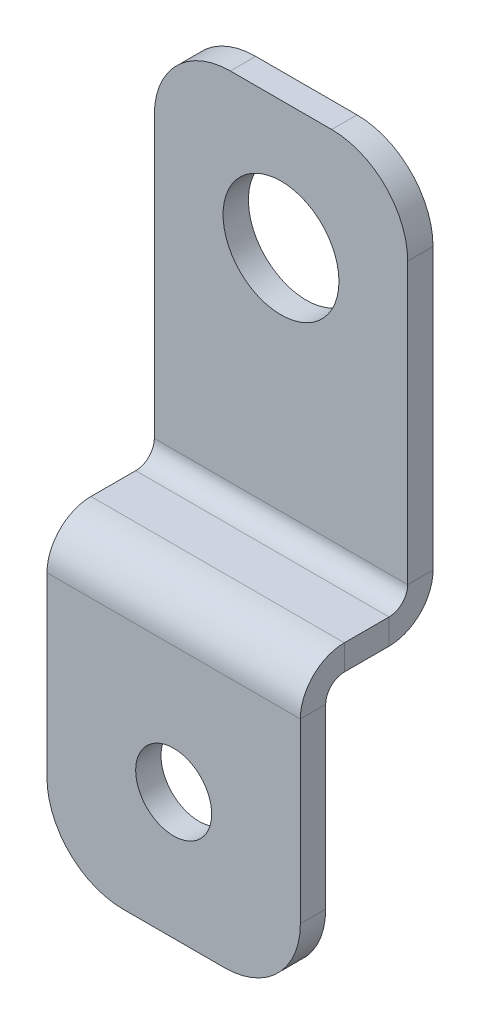
ISO-10303-21;
HEADER;
FILE_DESCRIPTION(('STEP AP214'),'2;1');
FILE_NAME('part.step','',(''),(''),'','','');
FILE_SCHEMA(('AUTOMOTIVE_DESIGN { 1 0 10303 214 1 1 1 1 }'));
ENDSEC;
DATA;
#1=APPLICATION_CONTEXT('core data for automotive mechanical design processes');
#2=APPLICATION_PROTOCOL_DEFINITION('international standard','automotive_design',2000,#1);
#3=PRODUCT_CONTEXT('',#1,'mechanical');
#4=PRODUCT('Part','Part','',(#3));
#5=PRODUCT_RELATED_PRODUCT_CATEGORY('part','',(#4));
#6=PRODUCT_DEFINITION_FORMATION('','',#4);
#7=PRODUCT_DEFINITION_CONTEXT('part definition',#1,'design');
#8=PRODUCT_DEFINITION('design','',#6,#7);
#9=PRODUCT_DEFINITION_SHAPE('','',#8);
#10=(LENGTH_UNIT() NAMED_UNIT(*) SI_UNIT(.MILLI.,.METRE.));
#11=(NAMED_UNIT(*) PLANE_ANGLE_UNIT() SI_UNIT($,.RADIAN.));
#12=(NAMED_UNIT(*) SI_UNIT($,.STERADIAN.) SOLID_ANGLE_UNIT());
#13=UNCERTAINTY_MEASURE_WITH_UNIT(LENGTH_MEASURE(1.E-05),#10,'distance_accuracy_value','');
#14=(GEOMETRIC_REPRESENTATION_CONTEXT(3) GLOBAL_UNCERTAINTY_ASSIGNED_CONTEXT((#13)) GLOBAL_UNIT_ASSIGNED_CONTEXT((#10,
#11,#12)) REPRESENTATION_CONTEXT('',''));
#15=CARTESIAN_POINT('',(0.,0.,0.));
#16=DIRECTION('',(0.,0.,1.));
#17=DIRECTION('',(1.,0.,0.));
#18=AXIS2_PLACEMENT_3D('',#15,#16,#17);
#19=CARTESIAN_POINT('',(0.,0.,1.));
#20=DIRECTION('',(0.,0.,1.));
#21=DIRECTION('',(1.,0.,0.));
#22=AXIS2_PLACEMENT_3D('',#19,#20,#21);
#23=PLANE('',#22);
#24=DIRECTION('',(-1.,0.,0.));
#25=VECTOR('',#24,1.);
#26=CARTESIAN_POINT('',(-514.974194852609,-14.350283508699,1.));
#27=LINE('',#26,#25);
#28=CARTESIAN_POINT('',(-507.974194852609,-14.350283508699,1.));
#29=VERTEX_POINT('',#28);
#30=CARTESIAN_POINT('',(-511.974194852609,-14.350283508699,1.));
#31=VERTEX_POINT('',#30);
#32=EDGE_CURVE('E307',#29,#31,#27,.T.);
#33=ORIENTED_EDGE('',*,*,#32,.T.);
#34=CARTESIAN_POINT('',(-511.974194852609,-17.350283508699,1.));
#35=DIRECTION('',(0.,0.,1.));
#36=DIRECTION('',(1.,0.,0.));
#37=AXIS2_PLACEMENT_3D('',#34,#35,#36);
#38=CIRCLE('',#37,3.);
#39=CARTESIAN_POINT('',(-514.974194852609,-17.350283508699,1.));
#40=VERTEX_POINT('',#39);
#41=EDGE_CURVE('E344',#31,#40,#38,.T.);
#42=ORIENTED_EDGE('',*,*,#41,.T.);
#43=DIRECTION('',(0.,-1.,0.));
#44=VECTOR('',#43,1.);
#45=CARTESIAN_POINT('',(-514.974194852609,-14.350283508699,1.));
#46=LINE('',#45,#44);
#47=CARTESIAN_POINT('',(-514.974194852609,-28.4078112950588,1.));
#48=VERTEX_POINT('',#47);
#49=EDGE_CURVE('E301',#40,#48,#46,.T.);
#50=ORIENTED_EDGE('',*,*,#49,.T.);
#51=DIRECTION('',(1.,0.,0.));
#52=VECTOR('',#51,1.);
#53=CARTESIAN_POINT('',(-514.974194852609,-28.4078112950588,1.));
#54=LINE('',#53,#52);
#55=CARTESIAN_POINT('',(-504.974194852609,-28.4078112950588,1.));
#56=VERTEX_POINT('',#55);
#57=EDGE_CURVE('E303',#48,#56,#54,.T.);
#58=ORIENTED_EDGE('',*,*,#57,.T.);
#59=DIRECTION('',(0.,1.,0.));
#60=VECTOR('',#59,1.);
#61=CARTESIAN_POINT('',(-504.974194852609,-14.350283508699,1.));
#62=LINE('',#61,#60);
#63=CARTESIAN_POINT('',(-504.974194852609,-17.350283508699,1.));
#64=VERTEX_POINT('',#63);
#65=EDGE_CURVE('E306',#56,#64,#62,.T.);
#66=ORIENTED_EDGE('',*,*,#65,.T.);
#67=CARTESIAN_POINT('',(-507.974194852609,-17.350283508699,1.));
#68=DIRECTION('',(0.,0.,1.));
#69=DIRECTION('',(1.,0.,0.));
#70=AXIS2_PLACEMENT_3D('',#67,#68,#69);
#71=CIRCLE('',#70,3.);
#72=EDGE_CURVE('E339',#64,#29,#71,.T.);
#73=ORIENTED_EDGE('',*,*,#72,.T.);
#74=EDGE_LOOP('',(#33,#42,#50,#58,#66,#73));
#75=FACE_BOUND('',#74,.T.);
#76=CARTESIAN_POINT('',(-509.974194852609,-19.4,1.));
#77=DIRECTION('',(0.,0.,1.));
#78=DIRECTION('',(1.,0.,0.));
#79=AXIS2_PLACEMENT_3D('',#76,#77,#78);
#80=CIRCLE('',#79,2.28730752562085);
#81=CARTESIAN_POINT('',(-507.686887326988,-19.4,1.));
#82=VERTEX_POINT('',#81);
#83=EDGE_CURVE('E294',#82,#82,#80,.T.);
#84=ORIENTED_EDGE('',*,*,#83,.F.);
#85=EDGE_LOOP('',(#84));
#86=FACE_BOUND('',#85,.T.);
#87=ADVANCED_FACE('F82',(#75,#86),#23,.T.);
#88=CARTESIAN_POINT('',(0.,0.,0.));
#89=DIRECTION('',(0.,0.,1.));
#90=DIRECTION('',(1.,0.,0.));
#91=AXIS2_PLACEMENT_3D('',#88,#89,#90);
#92=PLANE('',#91);
#93=DIRECTION('',(0.,-1.,0.));
#94=VECTOR('',#93,1.);
#95=CARTESIAN_POINT('',(-514.974194852609,-14.350283508699,0.));
#96=LINE('',#95,#94);
#97=CARTESIAN_POINT('',(-514.974194852609,-17.350283508699,0.));
#98=VERTEX_POINT('',#97);
#99=CARTESIAN_POINT('',(-514.974194852609,-28.4078112950588,0.));
#100=VERTEX_POINT('',#99);
#101=EDGE_CURVE('E296',#98,#100,#96,.T.);
#102=ORIENTED_EDGE('',*,*,#101,.F.);
#103=CARTESIAN_POINT('',(-511.974194852609,-17.350283508699,0.));
#104=DIRECTION('',(0.,0.,1.));
#105=DIRECTION('',(1.,0.,0.));
#106=AXIS2_PLACEMENT_3D('',#103,#104,#105);
#107=CIRCLE('',#106,3.);
#108=CARTESIAN_POINT('',(-511.974194852609,-14.350283508699,0.));
#109=VERTEX_POINT('',#108);
#110=EDGE_CURVE('E331',#98,#109,#107,.F.);
#111=ORIENTED_EDGE('',*,*,#110,.T.);
#112=DIRECTION('',(-1.,0.,0.));
#113=VECTOR('',#112,1.);
#114=CARTESIAN_POINT('',(-514.974194852609,-14.350283508699,0.));
#115=LINE('',#114,#113);
#116=CARTESIAN_POINT('',(-507.974194852609,-14.350283508699,0.));
#117=VERTEX_POINT('',#116);
#118=EDGE_CURVE('E302',#117,#109,#115,.T.);
#119=ORIENTED_EDGE('',*,*,#118,.F.);
#120=CARTESIAN_POINT('',(-507.974194852609,-17.350283508699,0.));
#121=DIRECTION('',(0.,0.,1.));
#122=DIRECTION('',(1.,0.,0.));
#123=AXIS2_PLACEMENT_3D('',#120,#121,#122);
#124=CIRCLE('',#123,3.);
#125=CARTESIAN_POINT('',(-504.974194852609,-17.350283508699,0.));
#126=VERTEX_POINT('',#125);
#127=EDGE_CURVE('E326',#117,#126,#124,.F.);
#128=ORIENTED_EDGE('',*,*,#127,.T.);
#129=DIRECTION('',(0.,1.,0.));
#130=VECTOR('',#129,1.);
#131=CARTESIAN_POINT('',(-504.974194852609,-14.350283508699,0.));
#132=LINE('',#131,#130);
#133=CARTESIAN_POINT('',(-504.974194852609,-28.4078112950588,0.));
#134=VERTEX_POINT('',#133);
#135=EDGE_CURVE('E320',#134,#126,#132,.T.);
#136=ORIENTED_EDGE('',*,*,#135,.F.);
#137=DIRECTION('',(1.,0.,0.));
#138=VECTOR('',#137,1.);
#139=CARTESIAN_POINT('',(-514.974194852609,-28.4078112950588,0.));
#140=LINE('',#139,#138);
#141=EDGE_CURVE('E313',#100,#134,#140,.T.);
#142=ORIENTED_EDGE('',*,*,#141,.F.);
#143=EDGE_LOOP('',(#102,#111,#119,#128,#136,#142));
#144=FACE_BOUND('',#143,.T.);
#145=CARTESIAN_POINT('',(-509.974194852609,-19.4,0.));
#146=DIRECTION('',(0.,0.,1.));
#147=DIRECTION('',(1.,0.,0.));
#148=AXIS2_PLACEMENT_3D('',#145,#146,#147);
#149=CIRCLE('',#148,2.28730752562085);
#150=CARTESIAN_POINT('',(-507.686887326988,-19.4,0.));
#151=VERTEX_POINT('',#150);
#152=EDGE_CURVE('E288',#151,#151,#149,.T.);
#153=ORIENTED_EDGE('',*,*,#152,.T.);
#154=EDGE_LOOP('',(#153));
#155=FACE_BOUND('',#154,.T.);
#156=ADVANCED_FACE('F431',(#144,#155),#92,.F.);
#157=CARTESIAN_POINT('',(-514.974194852609,-14.350283508699,1.));
#158=DIRECTION('',(1.,0.,0.));
#159=DIRECTION('',(0.,0.,-1.));
#160=AXIS2_PLACEMENT_3D('',#157,#158,#159);
#161=PLANE('',#160);
#162=ORIENTED_EDGE('',*,*,#49,.F.);
#163=DIRECTION('',(0.,0.,-1.));
#164=VECTOR('',#163,1.);
#165=CARTESIAN_POINT('',(-514.974194852609,-17.350283508699,1.));
#166=LINE('',#165,#164);
#167=EDGE_CURVE('E329',#40,#98,#166,.T.);
#168=ORIENTED_EDGE('',*,*,#167,.T.);
#169=ORIENTED_EDGE('',*,*,#101,.T.);
#170=DIRECTION('',(0.,0.,-1.));
#171=VECTOR('',#170,1.);
#172=CARTESIAN_POINT('',(-514.974194852609,-28.4078112950588,1.));
#173=LINE('',#172,#171);
#174=EDGE_CURVE('E323',#48,#100,#173,.T.);
#175=ORIENTED_EDGE('',*,*,#174,.F.);
#176=EDGE_LOOP('',(#162,#168,#169,#175));
#177=FACE_BOUND('',#176,.T.);
#178=ADVANCED_FACE('F401',(#177),#161,.F.);
#179=CARTESIAN_POINT('',(-504.974194852609,-14.350283508699,1.));
#180=DIRECTION('',(-1.,0.,0.));
#181=DIRECTION('',(0.,0.,1.));
#182=AXIS2_PLACEMENT_3D('',#179,#180,#181);
#183=PLANE('',#182);
#184=ORIENTED_EDGE('',*,*,#135,.T.);
#185=DIRECTION('',(0.,0.,-1.));
#186=VECTOR('',#185,1.);
#187=CARTESIAN_POINT('',(-504.974194852609,-17.350283508699,1.));
#188=LINE('',#187,#186);
#189=EDGE_CURVE('E345',#126,#64,#188,.F.);
#190=ORIENTED_EDGE('',*,*,#189,.T.);
#191=ORIENTED_EDGE('',*,*,#65,.F.);
#192=DIRECTION('',(0.,0.,-1.));
#193=VECTOR('',#192,1.);
#194=CARTESIAN_POINT('',(-504.974194852609,-28.4078112950588,1.));
#195=LINE('',#194,#193);
#196=EDGE_CURVE('E315',#56,#134,#195,.T.);
#197=ORIENTED_EDGE('',*,*,#196,.T.);
#198=EDGE_LOOP('',(#184,#190,#191,#197));
#199=FACE_BOUND('',#198,.T.);
#200=ADVANCED_FACE('F418',(#199),#183,.F.);
#201=CARTESIAN_POINT('',(-514.974194852609,-14.350283508699,1.));
#202=DIRECTION('',(0.,-1.,0.));
#203=DIRECTION('',(0.,0.,-1.));
#204=AXIS2_PLACEMENT_3D('',#201,#202,#203);
#205=PLANE('',#204);
#206=ORIENTED_EDGE('',*,*,#118,.T.);
#207=DIRECTION('',(0.,0.,-1.));
#208=VECTOR('',#207,1.);
#209=CARTESIAN_POINT('',(-511.974194852609,-14.350283508699,1.));
#210=LINE('',#209,#208);
#211=EDGE_CURVE('E340',#109,#31,#210,.F.);
#212=ORIENTED_EDGE('',*,*,#211,.T.);
#213=ORIENTED_EDGE('',*,*,#32,.F.);
#214=DIRECTION('',(0.,0.,-1.));
#215=VECTOR('',#214,1.);
#216=CARTESIAN_POINT('',(-507.974194852609,-14.350283508699,1.));
#217=LINE('',#216,#215);
#218=EDGE_CURVE('E333',#29,#117,#217,.T.);
#219=ORIENTED_EDGE('',*,*,#218,.T.);
#220=EDGE_LOOP('',(#206,#212,#213,#219));
#221=FACE_BOUND('',#220,.T.);
#222=ADVANCED_FACE('F439',(#221),#205,.F.);
#223=CARTESIAN_POINT('',(-509.974194852609,-19.4,1.));
#224=DIRECTION('',(0.,0.,-1.));
#225=DIRECTION('',(-1.,0.,0.));
#226=AXIS2_PLACEMENT_3D('',#223,#224,#225);
#227=CYLINDRICAL_SURFACE('',#226,2.28730752562085);
#228=ORIENTED_EDGE('',*,*,#83,.T.);
#229=EDGE_LOOP('',(#228));
#230=FACE_BOUND('',#229,.T.);
#231=ORIENTED_EDGE('',*,*,#152,.F.);
#232=EDGE_LOOP('',(#231));
#233=FACE_BOUND('',#232,.T.);
#234=ADVANCED_FACE('F430',(#230,#233),#227,.F.);
#235=CARTESIAN_POINT('',(-514.974194852609,-28.4078112950588,1.7366));
#236=DIRECTION('',(-1.,0.,0.));
#237=DIRECTION('',(0.,0.,1.));
#238=AXIS2_PLACEMENT_3D('',#235,#236,#237);
#239=PLANE('',#238);
#240=DIRECTION('',(0.,1.,0.));
#241=VECTOR('',#240,1.);
#242=CARTESIAN_POINT('',(-514.974194852609,-30.1444112950588,1.73659999999999));
#243=LINE('',#242,#241);
#244=CARTESIAN_POINT('',(-514.974194852609,-29.1444112950588,1.7366));
#245=VERTEX_POINT('',#244);
#246=CARTESIAN_POINT('',(-514.974194852609,-30.1444112950588,1.73659999999999));
#247=VERTEX_POINT('',#246);
#248=EDGE_CURVE('E248',#245,#247,#243,.F.);
#249=ORIENTED_EDGE('',*,*,#248,.F.);
#250=CARTESIAN_POINT('',(-514.974194852609,-28.4078112950588,1.7366));
#251=DIRECTION('',(1.,0.,0.));
#252=DIRECTION('',(0.,0.,-1.));
#253=AXIS2_PLACEMENT_3D('',#250,#251,#252);
#254=CIRCLE('',#253,0.7366);
#255=EDGE_CURVE('E287',#48,#245,#254,.F.);
#256=ORIENTED_EDGE('',*,*,#255,.F.);
#257=ORIENTED_EDGE('',*,*,#174,.T.);
#258=CARTESIAN_POINT('',(-514.974194852609,-28.4078112950588,1.7366));
#259=DIRECTION('',(1.,0.,0.));
#260=DIRECTION('',(0.,0.,-1.));
#261=AXIS2_PLACEMENT_3D('',#258,#259,#260);
#262=CIRCLE('',#261,1.7366);
#263=EDGE_CURVE('E285',#100,#247,#262,.F.);
#264=ORIENTED_EDGE('',*,*,#263,.T.);
#265=EDGE_LOOP('',(#249,#256,#257,#264));
#266=FACE_BOUND('',#265,.T.);
#267=ADVANCED_FACE('F396',(#266),#239,.T.);
#268=CARTESIAN_POINT('',(-504.974194852609,-28.4078112950588,1.7366));
#269=DIRECTION('',(-1.,0.,0.));
#270=DIRECTION('',(0.,0.,1.));
#271=AXIS2_PLACEMENT_3D('',#268,#269,#270);
#272=PLANE('',#271);
#273=CARTESIAN_POINT('',(-504.974194852609,-28.4078112950588,1.7366));
#274=DIRECTION('',(1.,0.,0.));
#275=DIRECTION('',(0.,0.,-1.));
#276=AXIS2_PLACEMENT_3D('',#273,#274,#275);
#277=CIRCLE('',#276,0.7366);
#278=CARTESIAN_POINT('',(-504.974194852609,-29.1444112950588,1.7366));
#279=VERTEX_POINT('',#278);
#280=EDGE_CURVE('E256',#279,#56,#277,.T.);
#281=ORIENTED_EDGE('',*,*,#280,.F.);
#282=DIRECTION('',(0.,1.,0.));
#283=VECTOR('',#282,1.);
#284=CARTESIAN_POINT('',(-504.974194852609,-29.1444112950588,1.7366));
#285=LINE('',#284,#283);
#286=CARTESIAN_POINT('',(-504.974194852609,-30.1444112950588,1.73659999999999));
#287=VERTEX_POINT('',#286);
#288=EDGE_CURVE('E279',#279,#287,#285,.F.);
#289=ORIENTED_EDGE('',*,*,#288,.T.);
#290=CARTESIAN_POINT('',(-504.974194852609,-28.4078112950588,1.7366));
#291=DIRECTION('',(1.,0.,0.));
#292=DIRECTION('',(0.,0.,-1.));
#293=AXIS2_PLACEMENT_3D('',#290,#291,#292);
#294=CIRCLE('',#293,1.7366);
#295=EDGE_CURVE('E290',#287,#134,#294,.T.);
#296=ORIENTED_EDGE('',*,*,#295,.T.);
#297=ORIENTED_EDGE('',*,*,#196,.F.);
#298=EDGE_LOOP('',(#281,#289,#296,#297));
#299=FACE_BOUND('',#298,.T.);
#300=ADVANCED_FACE('F419',(#299),#272,.F.);
#301=CARTESIAN_POINT('',(-504.974194852609,-28.4078112950588,1.7366));
#302=DIRECTION('',(1.,0.,0.));
#303=DIRECTION('',(0.,-1.,0.));
#304=AXIS2_PLACEMENT_3D('',#301,#302,#303);
#305=CYLINDRICAL_SURFACE('',#304,1.7366);
#306=ORIENTED_EDGE('',*,*,#141,.T.);
#307=ORIENTED_EDGE('',*,*,#295,.F.);
#308=DIRECTION('',(1.,0.,0.));
#309=VECTOR('',#308,1.);
#310=CARTESIAN_POINT('',(-514.974194852609,-30.1444112950588,1.73659999999999));
#311=LINE('',#310,#309);
#312=EDGE_CURVE('E274',#287,#247,#311,.F.);
#313=ORIENTED_EDGE('',*,*,#312,.T.);
#314=ORIENTED_EDGE('',*,*,#263,.F.);
#315=EDGE_LOOP('',(#306,#307,#313,#314));
#316=FACE_BOUND('',#315,.T.);
#317=ADVANCED_FACE('F391',(#316),#305,.T.);
#318=CARTESIAN_POINT('',(-504.974194852609,-28.4078112950588,1.7366));
#319=DIRECTION('',(1.,0.,0.));
#320=DIRECTION('',(0.,-1.,0.));
#321=AXIS2_PLACEMENT_3D('',#318,#319,#320);
#322=CYLINDRICAL_SURFACE('',#321,0.7366);
#323=ORIENTED_EDGE('',*,*,#57,.F.);
#324=ORIENTED_EDGE('',*,*,#255,.T.);
#325=DIRECTION('',(1.,0.,0.));
#326=VECTOR('',#325,1.);
#327=CARTESIAN_POINT('',(-514.974194852609,-29.1444112950588,1.7366));
#328=LINE('',#327,#326);
#329=EDGE_CURVE('E278',#245,#279,#328,.T.);
#330=ORIENTED_EDGE('',*,*,#329,.T.);
#331=ORIENTED_EDGE('',*,*,#280,.T.);
#332=EDGE_LOOP('',(#323,#324,#330,#331));
#333=FACE_BOUND('',#332,.T.);
#334=ADVANCED_FACE('F410',(#333),#322,.F.);
#335=CARTESIAN_POINT('',(-514.974194852609,-30.1444112950588,0.999999999999997));
#336=DIRECTION('',(1.,0.,0.));
#337=DIRECTION('',(0.,0.,-1.));
#338=AXIS2_PLACEMENT_3D('',#335,#336,#337);
#339=PLANE('',#338);
#340=ORIENTED_EDGE('',*,*,#248,.T.);
#341=DIRECTION('',(0.,0.,-1.));
#342=VECTOR('',#341,1.);
#343=CARTESIAN_POINT('',(-514.974194852609,-30.1444112950588,-1.21762754510021E-13));
#344=LINE('',#343,#342);
#345=CARTESIAN_POINT('',(-514.974194852609,-30.1444112950588,3.5));
#346=VERTEX_POINT('',#345);
#347=EDGE_CURVE('E261',#346,#247,#344,.T.);
#348=ORIENTED_EDGE('',*,*,#347,.F.);
#349=DIRECTION('',(0.,1.,0.));
#350=VECTOR('',#349,1.);
#351=CARTESIAN_POINT('',(-514.974194852609,-30.1444112950588,3.5));
#352=LINE('',#351,#350);
#353=CARTESIAN_POINT('',(-514.974194852609,-29.1444112950589,3.5));
#354=VERTEX_POINT('',#353);
#355=EDGE_CURVE('E260',#346,#354,#352,.T.);
#356=ORIENTED_EDGE('',*,*,#355,.T.);
#357=DIRECTION('',(0.,0.,1.));
#358=VECTOR('',#357,1.);
#359=CARTESIAN_POINT('',(-514.974194852609,-29.1444112950588,1.));
#360=LINE('',#359,#358);
#361=EDGE_CURVE('E272',#354,#245,#360,.F.);
#362=ORIENTED_EDGE('',*,*,#361,.T.);
#363=EDGE_LOOP('',(#340,#348,#356,#362));
#364=FACE_BOUND('',#363,.T.);
#365=ADVANCED_FACE('F388',(#364),#339,.F.);
#366=CARTESIAN_POINT('',(-504.974194852609,-30.1444112950588,3.5));
#367=DIRECTION('',(-1.,0.,0.));
#368=DIRECTION('',(0.,0.,1.));
#369=AXIS2_PLACEMENT_3D('',#366,#367,#368);
#370=PLANE('',#369);
#371=ORIENTED_EDGE('',*,*,#288,.F.);
#372=DIRECTION('',(0.,0.,-1.));
#373=VECTOR('',#372,1.);
#374=CARTESIAN_POINT('',(-504.974194852609,-29.1444112950588,3.5));
#375=LINE('',#374,#373);
#376=CARTESIAN_POINT('',(-504.974194852609,-29.1444112950588,3.5));
#377=VERTEX_POINT('',#376);
#378=EDGE_CURVE('E268',#279,#377,#375,.F.);
#379=ORIENTED_EDGE('',*,*,#378,.T.);
#380=DIRECTION('',(0.,1.,0.));
#381=VECTOR('',#380,1.);
#382=CARTESIAN_POINT('',(-504.974194852609,-30.1444112950588,3.5));
#383=LINE('',#382,#381);
#384=CARTESIAN_POINT('',(-504.974194852609,-30.1444112950588,3.5));
#385=VERTEX_POINT('',#384);
#386=EDGE_CURVE('E251',#385,#377,#383,.T.);
#387=ORIENTED_EDGE('',*,*,#386,.F.);
#388=DIRECTION('',(0.,0.,1.));
#389=VECTOR('',#388,1.);
#390=CARTESIAN_POINT('',(-504.974194852609,-30.1444112950588,-1.21762754510021E-13));
#391=LINE('',#390,#389);
#392=EDGE_CURVE('E262',#287,#385,#391,.T.);
#393=ORIENTED_EDGE('',*,*,#392,.F.);
#394=EDGE_LOOP('',(#371,#379,#387,#393));
#395=FACE_BOUND('',#394,.T.);
#396=ADVANCED_FACE('F385',(#395),#370,.F.);
#397=CARTESIAN_POINT('',(0.,-30.1444112950588,-1.21762754510021E-13));
#398=DIRECTION('',(0.,1.,0.));
#399=DIRECTION('',(0.,0.,1.));
#400=AXIS2_PLACEMENT_3D('',#397,#398,#399);
#401=PLANE('',#400);
#402=ORIENTED_EDGE('',*,*,#312,.F.);
#403=ORIENTED_EDGE('',*,*,#392,.T.);
#404=DIRECTION('',(-1.,0.,0.));
#405=VECTOR('',#404,1.);
#406=CARTESIAN_POINT('',(0.,-30.1444112950588,3.5));
#407=LINE('',#406,#405);
#408=EDGE_CURVE('E263',#385,#346,#407,.T.);
#409=ORIENTED_EDGE('',*,*,#408,.T.);
#410=ORIENTED_EDGE('',*,*,#347,.T.);
#411=EDGE_LOOP('',(#402,#403,#409,#410));
#412=FACE_BOUND('',#411,.T.);
#413=ADVANCED_FACE('F394',(#412),#401,.F.);
#414=CARTESIAN_POINT('',(0.,-29.1444112950588,-1.18271273171178E-13));
#415=DIRECTION('',(0.,1.,0.));
#416=DIRECTION('',(0.,0.,1.));
#417=AXIS2_PLACEMENT_3D('',#414,#415,#416);
#418=PLANE('',#417);
#419=ORIENTED_EDGE('',*,*,#378,.F.);
#420=ORIENTED_EDGE('',*,*,#329,.F.);
#421=ORIENTED_EDGE('',*,*,#361,.F.);
#422=DIRECTION('',(1.,0.,0.));
#423=VECTOR('',#422,1.);
#424=CARTESIAN_POINT('',(-514.974194852609,-29.1444112950588,3.5));
#425=LINE('',#424,#423);
#426=EDGE_CURVE('E209',#377,#354,#425,.F.);
#427=ORIENTED_EDGE('',*,*,#426,.F.);
#428=EDGE_LOOP('',(#419,#420,#421,#427));
#429=FACE_BOUND('',#428,.T.);
#430=ADVANCED_FACE('F389',(#429),#418,.T.);
#431=CARTESIAN_POINT('',(-504.974194852609,-30.8810112950588,3.5));
#432=DIRECTION('',(1.,0.,0.));
#433=DIRECTION('',(0.,0.,-1.));
#434=AXIS2_PLACEMENT_3D('',#431,#432,#433);
#435=PLANE('',#434);
#436=DIRECTION('',(0.,0.,-1.));
#437=VECTOR('',#436,1.);
#438=CARTESIAN_POINT('',(-504.974194852609,-30.8810112950589,5.2366));
#439=LINE('',#438,#437);
#440=CARTESIAN_POINT('',(-504.974194852609,-30.8810112950588,4.2366));
#441=VERTEX_POINT('',#440);
#442=CARTESIAN_POINT('',(-504.974194852609,-30.8810112950588,5.2366));
#443=VERTEX_POINT('',#442);
#444=EDGE_CURVE('E244',#441,#443,#439,.F.);
#445=ORIENTED_EDGE('',*,*,#444,.F.);
#446=CARTESIAN_POINT('',(-504.974194852609,-30.8810112950588,3.5));
#447=DIRECTION('',(-1.,0.,0.));
#448=DIRECTION('',(0.,0.,1.));
#449=AXIS2_PLACEMENT_3D('',#446,#447,#448);
#450=CIRCLE('',#449,0.736599999999999);
#451=EDGE_CURVE('E215',#385,#441,#450,.F.);
#452=ORIENTED_EDGE('',*,*,#451,.F.);
#453=ORIENTED_EDGE('',*,*,#386,.T.);
#454=CARTESIAN_POINT('',(-504.974194852609,-30.8810112950588,3.5));
#455=DIRECTION('',(-1.,0.,0.));
#456=DIRECTION('',(0.,0.,1.));
#457=AXIS2_PLACEMENT_3D('',#454,#455,#456);
#458=CIRCLE('',#457,1.7366);
#459=EDGE_CURVE('E211',#377,#443,#458,.F.);
#460=ORIENTED_EDGE('',*,*,#459,.T.);
#461=EDGE_LOOP('',(#445,#452,#453,#460));
#462=FACE_BOUND('',#461,.T.);
#463=ADVANCED_FACE('F380',(#462),#435,.T.);
#464=CARTESIAN_POINT('',(-514.974194852609,-30.8810112950588,3.5));
#465=DIRECTION('',(1.,0.,0.));
#466=DIRECTION('',(0.,0.,-1.));
#467=AXIS2_PLACEMENT_3D('',#464,#465,#466);
#468=PLANE('',#467);
#469=CARTESIAN_POINT('',(-514.974194852609,-30.8810112950588,3.5));
#470=DIRECTION('',(-1.,0.,0.));
#471=DIRECTION('',(0.,0.,1.));
#472=AXIS2_PLACEMENT_3D('',#469,#470,#471);
#473=CIRCLE('',#472,0.736599999999999);
#474=CARTESIAN_POINT('',(-514.974194852609,-30.8810112950588,4.2366));
#475=VERTEX_POINT('',#474);
#476=EDGE_CURVE('E217',#475,#346,#473,.T.);
#477=ORIENTED_EDGE('',*,*,#476,.F.);
#478=DIRECTION('',(0.,0.,-1.));
#479=VECTOR('',#478,1.);
#480=CARTESIAN_POINT('',(-514.974194852609,-30.8810112950588,4.2366));
#481=LINE('',#480,#479);
#482=CARTESIAN_POINT('',(-514.974194852609,-30.8810112950588,5.2366));
#483=VERTEX_POINT('',#482);
#484=EDGE_CURVE('E216',#475,#483,#481,.F.);
#485=ORIENTED_EDGE('',*,*,#484,.T.);
#486=CARTESIAN_POINT('',(-514.974194852609,-30.8810112950588,3.5));
#487=DIRECTION('',(-1.,0.,0.));
#488=DIRECTION('',(0.,0.,1.));
#489=AXIS2_PLACEMENT_3D('',#486,#487,#488);
#490=CIRCLE('',#489,1.7366);
#491=EDGE_CURVE('E204',#483,#354,#490,.T.);
#492=ORIENTED_EDGE('',*,*,#491,.T.);
#493=ORIENTED_EDGE('',*,*,#355,.F.);
#494=EDGE_LOOP('',(#477,#485,#492,#493));
#495=FACE_BOUND('',#494,.T.);
#496=ADVANCED_FACE('F220',(#495),#468,.F.);
#497=CARTESIAN_POINT('',(-514.974194852609,-30.8810112950588,3.5));
#498=DIRECTION('',(-1.,0.,0.));
#499=DIRECTION('',(0.,0.,1.));
#500=AXIS2_PLACEMENT_3D('',#497,#498,#499);
#501=CYLINDRICAL_SURFACE('',#500,1.7366);
#502=ORIENTED_EDGE('',*,*,#426,.T.);
#503=ORIENTED_EDGE('',*,*,#491,.F.);
#504=DIRECTION('',(-1.,0.,0.));
#505=VECTOR('',#504,1.);
#506=CARTESIAN_POINT('',(-504.974194852609,-30.8810112950589,5.2366));
#507=LINE('',#506,#505);
#508=EDGE_CURVE('E207',#483,#443,#507,.F.);
#509=ORIENTED_EDGE('',*,*,#508,.T.);
#510=ORIENTED_EDGE('',*,*,#459,.F.);
#511=EDGE_LOOP('',(#502,#503,#509,#510));
#512=FACE_BOUND('',#511,.T.);
#513=ADVANCED_FACE('F205',(#512),#501,.T.);
#514=CARTESIAN_POINT('',(-514.974194852609,-30.8810112950588,3.5));
#515=DIRECTION('',(-1.,0.,0.));
#516=DIRECTION('',(0.,0.,1.));
#517=AXIS2_PLACEMENT_3D('',#514,#515,#516);
#518=CYLINDRICAL_SURFACE('',#517,0.736599999999999);
#519=ORIENTED_EDGE('',*,*,#408,.F.);
#520=ORIENTED_EDGE('',*,*,#451,.T.);
#521=DIRECTION('',(-1.,0.,0.));
#522=VECTOR('',#521,1.);
#523=CARTESIAN_POINT('',(-504.974194852609,-30.8810112950589,4.2366));
#524=LINE('',#523,#522);
#525=EDGE_CURVE('E225',#441,#475,#524,.T.);
#526=ORIENTED_EDGE('',*,*,#525,.T.);
#527=ORIENTED_EDGE('',*,*,#476,.T.);
#528=EDGE_LOOP('',(#519,#520,#526,#527));
#529=FACE_BOUND('',#528,.T.);
#530=ADVANCED_FACE('F372',(#529),#518,.F.);
#531=CARTESIAN_POINT('',(-504.974194852609,-30.1444112950589,5.2366));
#532=DIRECTION('',(-1.,0.,0.));
#533=DIRECTION('',(0.,0.,1.));
#534=AXIS2_PLACEMENT_3D('',#531,#532,#533);
#535=PLANE('',#534);
#536=DIRECTION('',(0.,1.,0.));
#537=VECTOR('',#536,1.);
#538=CARTESIAN_POINT('',(-504.974194852609,0.,5.23660000000002));
#539=LINE('',#538,#537);
#540=CARTESIAN_POINT('',(-504.974194852609,-37.8810112950588,5.23659999999999));
#541=VERTEX_POINT('',#540);
#542=EDGE_CURVE('E230',#541,#443,#539,.T.);
#543=ORIENTED_EDGE('',*,*,#542,.F.);
#544=DIRECTION('',(0.,0.,-1.));
#545=VECTOR('',#544,1.);
#546=CARTESIAN_POINT('',(-504.974194852609,-37.8810112950588,5.23659999999999));
#547=LINE('',#546,#545);
#548=CARTESIAN_POINT('',(-504.974194852609,-37.8810112950588,4.23659999999999));
#549=VERTEX_POINT('',#548);
#550=EDGE_CURVE('E342',#541,#549,#547,.T.);
#551=ORIENTED_EDGE('',*,*,#550,.T.);
#552=DIRECTION('',(0.,-1.,0.));
#553=VECTOR('',#552,1.);
#554=CARTESIAN_POINT('',(-504.974194852609,-30.1444112950589,4.2366));
#555=LINE('',#554,#553);
#556=EDGE_CURVE('E229',#549,#441,#555,.F.);
#557=ORIENTED_EDGE('',*,*,#556,.T.);
#558=ORIENTED_EDGE('',*,*,#444,.T.);
#559=EDGE_LOOP('',(#543,#551,#557,#558));
#560=FACE_BOUND('',#559,.T.);
#561=ADVANCED_FACE('F363',(#560),#535,.F.);
#562=CARTESIAN_POINT('',(-514.974194852609,-40.8810112950588,5.23659999999999));
#563=DIRECTION('',(1.,0.,0.));
#564=DIRECTION('',(0.,0.,-1.));
#565=AXIS2_PLACEMENT_3D('',#562,#563,#564);
#566=PLANE('',#565);
#567=DIRECTION('',(0.,1.,0.));
#568=VECTOR('',#567,1.);
#569=CARTESIAN_POINT('',(-514.974194852609,-40.8810112950588,4.23659999999999));
#570=LINE('',#569,#568);
#571=CARTESIAN_POINT('',(-514.974194852609,-37.8810112950588,4.23659999999999));
#572=VERTEX_POINT('',#571);
#573=EDGE_CURVE('E241',#475,#572,#570,.F.);
#574=ORIENTED_EDGE('',*,*,#573,.T.);
#575=DIRECTION('',(0.,0.,-1.));
#576=VECTOR('',#575,1.);
#577=CARTESIAN_POINT('',(-514.974194852609,-37.8810112950588,5.23659999999999));
#578=LINE('',#577,#576);
#579=CARTESIAN_POINT('',(-514.974194852609,-37.8810112950588,5.23659999999999));
#580=VERTEX_POINT('',#579);
#581=EDGE_CURVE('E13',#572,#580,#578,.F.);
#582=ORIENTED_EDGE('',*,*,#581,.T.);
#583=DIRECTION('',(0.,-1.,0.));
#584=VECTOR('',#583,1.);
#585=CARTESIAN_POINT('',(-514.974194852609,0.,5.23660000000002));
#586=LINE('',#585,#584);
#587=EDGE_CURVE('E228',#483,#580,#586,.T.);
#588=ORIENTED_EDGE('',*,*,#587,.F.);
#589=ORIENTED_EDGE('',*,*,#484,.F.);
#590=EDGE_LOOP('',(#574,#582,#588,#589));
#591=FACE_BOUND('',#590,.T.);
#592=ADVANCED_FACE('F235',(#591),#566,.F.);
#593=CARTESIAN_POINT('',(0.,0.,5.23660000000002));
#594=DIRECTION('',(0.,0.,-1.));
#595=DIRECTION('',(0.,1.,0.));
#596=AXIS2_PLACEMENT_3D('',#593,#594,#595);
#597=PLANE('',#596);
#598=CARTESIAN_POINT('',(-509.974194852609,-35.8810112950589,5.23659999999999));
#599=DIRECTION('',(0.,0.,-1.));
#600=DIRECTION('',(0.,1.,0.));
#601=AXIS2_PLACEMENT_3D('',#598,#599,#600);
#602=CIRCLE('',#601,1.49999999999997);
#603=CARTESIAN_POINT('',(-509.974194852609,-34.3810112950589,5.23659999999999));
#604=VERTEX_POINT('',#603);
#605=EDGE_CURVE('E247',#604,#604,#602,.T.);
#606=ORIENTED_EDGE('',*,*,#605,.T.);
#607=EDGE_LOOP('',(#606));
#608=FACE_BOUND('',#607,.T.);
#609=DIRECTION('',(1.,0.,0.));
#610=VECTOR('',#609,1.);
#611=CARTESIAN_POINT('',(0.,-40.8810112950588,5.23659999999999));
#612=LINE('',#611,#610);
#613=CARTESIAN_POINT('',(-511.974194852609,-40.8810112950588,5.23659999999999));
#614=VERTEX_POINT('',#613);
#615=CARTESIAN_POINT('',(-507.974194852609,-40.8810112950588,5.23659999999999));
#616=VERTEX_POINT('',#615);
#617=EDGE_CURVE('E231',#614,#616,#612,.T.);
#618=ORIENTED_EDGE('',*,*,#617,.T.);
#619=CARTESIAN_POINT('',(-507.974194852609,-37.8810112950588,5.23659999999999));
#620=DIRECTION('',(0.,0.,-1.));
#621=DIRECTION('',(0.,1.,0.));
#622=AXIS2_PLACEMENT_3D('',#619,#620,#621);
#623=CIRCLE('',#622,3.);
#624=EDGE_CURVE('E91',#616,#541,#623,.F.);
#625=ORIENTED_EDGE('',*,*,#624,.T.);
#626=ORIENTED_EDGE('',*,*,#542,.T.);
#627=ORIENTED_EDGE('',*,*,#508,.F.);
#628=ORIENTED_EDGE('',*,*,#587,.T.);
#629=CARTESIAN_POINT('',(-511.974194852609,-37.8810112950588,5.23659999999999));
#630=DIRECTION('',(0.,0.,-1.));
#631=DIRECTION('',(0.,1.,0.));
#632=AXIS2_PLACEMENT_3D('',#629,#630,#631);
#633=CIRCLE('',#632,3.);
#634=EDGE_CURVE('E358',#580,#614,#633,.F.);
#635=ORIENTED_EDGE('',*,*,#634,.T.);
#636=EDGE_LOOP('',(#618,#625,#626,#627,#628,#635));
#637=FACE_BOUND('',#636,.T.);
#638=ADVANCED_FACE('F222',(#608,#637),#597,.F.);
#639=CARTESIAN_POINT('',(0.,0.,4.23660000000002));
#640=DIRECTION('',(0.,0.,-1.));
#641=DIRECTION('',(0.,1.,0.));
#642=AXIS2_PLACEMENT_3D('',#639,#640,#641);
#643=PLANE('',#642);
#644=CARTESIAN_POINT('',(-509.974194852609,-35.8810112950589,4.23660000000002));
#645=DIRECTION('',(0.,0.,-1.));
#646=DIRECTION('',(-1.,0.,0.));
#647=AXIS2_PLACEMENT_3D('',#644,#645,#646);
#648=CIRCLE('',#647,1.49999999999997);
#649=CARTESIAN_POINT('',(-511.474194852609,-35.8810112950589,4.23660000000002));
#650=VERTEX_POINT('',#649);
#651=EDGE_CURVE('E714',#650,#650,#648,.T.);
#652=ORIENTED_EDGE('',*,*,#651,.F.);
#653=EDGE_LOOP('',(#652));
#654=FACE_BOUND('',#653,.T.);
#655=ORIENTED_EDGE('',*,*,#556,.F.);
#656=CARTESIAN_POINT('',(-507.974194852609,-37.8810112950588,4.23659999999999));
#657=DIRECTION('',(0.,0.,-1.));
#658=DIRECTION('',(0.,1.,0.));
#659=AXIS2_PLACEMENT_3D('',#656,#657,#658);
#660=CIRCLE('',#659,3.);
#661=CARTESIAN_POINT('',(-507.974194852609,-40.8810112950588,4.23659999999999));
#662=VERTEX_POINT('',#661);
#663=EDGE_CURVE('E347',#549,#662,#660,.T.);
#664=ORIENTED_EDGE('',*,*,#663,.T.);
#665=DIRECTION('',(-1.,0.,0.));
#666=VECTOR('',#665,1.);
#667=CARTESIAN_POINT('',(-504.974194852609,-40.8810112950588,4.23659999999999));
#668=LINE('',#667,#666);
#669=CARTESIAN_POINT('',(-511.974194852609,-40.8810112950588,4.23659999999999));
#670=VERTEX_POINT('',#669);
#671=EDGE_CURVE('E236',#670,#662,#668,.F.);
#672=ORIENTED_EDGE('',*,*,#671,.F.);
#673=CARTESIAN_POINT('',(-511.974194852609,-37.8810112950588,4.23659999999999));
#674=DIRECTION('',(0.,0.,-1.));
#675=DIRECTION('',(0.,1.,0.));
#676=AXIS2_PLACEMENT_3D('',#673,#674,#675);
#677=CIRCLE('',#676,3.);
#678=EDGE_CURVE('E350',#670,#572,#677,.T.);
#679=ORIENTED_EDGE('',*,*,#678,.T.);
#680=ORIENTED_EDGE('',*,*,#573,.F.);
#681=ORIENTED_EDGE('',*,*,#525,.F.);
#682=EDGE_LOOP('',(#655,#664,#672,#679,#680,#681));
#683=FACE_BOUND('',#682,.T.);
#684=ADVANCED_FACE('F370',(#654,#683),#643,.T.);
#685=CARTESIAN_POINT('',(-504.974194852609,-40.8810112950588,5.23659999999999));
#686=DIRECTION('',(0.,1.,0.));
#687=DIRECTION('',(0.,0.,1.));
#688=AXIS2_PLACEMENT_3D('',#685,#686,#687);
#689=PLANE('',#688);
#690=ORIENTED_EDGE('',*,*,#671,.T.);
#691=DIRECTION('',(0.,0.,-1.));
#692=VECTOR('',#691,1.);
#693=CARTESIAN_POINT('',(-507.974194852609,-40.8810112950588,5.23659999999999));
#694=LINE('',#693,#692);
#695=EDGE_CURVE('E106',#662,#616,#694,.F.);
#696=ORIENTED_EDGE('',*,*,#695,.T.);
#697=ORIENTED_EDGE('',*,*,#617,.F.);
#698=DIRECTION('',(0.,0.,-1.));
#699=VECTOR('',#698,1.);
#700=CARTESIAN_POINT('',(-511.974194852609,-40.8810112950588,5.23659999999999));
#701=LINE('',#700,#699);
#702=EDGE_CURVE('E355',#614,#670,#701,.T.);
#703=ORIENTED_EDGE('',*,*,#702,.T.);
#704=EDGE_LOOP('',(#690,#696,#697,#703));
#705=FACE_BOUND('',#704,.T.);
#706=ADVANCED_FACE('F367',(#705),#689,.F.);
#707=CARTESIAN_POINT('',(-509.974194852609,-35.8810112950589,6.23660000000002));
#708=DIRECTION('',(0.,0.,-1.));
#709=DIRECTION('',(-1.,0.,0.));
#710=AXIS2_PLACEMENT_3D('',#707,#708,#709);
#711=CYLINDRICAL_SURFACE('',#710,1.49999999999997);
#712=ORIENTED_EDGE('',*,*,#651,.T.);
#713=EDGE_LOOP('',(#712));
#714=FACE_BOUND('',#713,.T.);
#715=ORIENTED_EDGE('',*,*,#605,.F.);
#716=EDGE_LOOP('',(#715));
#717=FACE_BOUND('',#716,.T.);
#718=ADVANCED_FACE('F451',(#714,#717),#711,.F.);
#719=CARTESIAN_POINT('',(-511.974194852609,-17.350283508699,1.));
#720=DIRECTION('',(0.,0.,-1.));
#721=DIRECTION('',(-1.,0.,0.));
#722=AXIS2_PLACEMENT_3D('',#719,#720,#721);
#723=CYLINDRICAL_SURFACE('',#722,3.);
#724=ORIENTED_EDGE('',*,*,#41,.F.);
#725=ORIENTED_EDGE('',*,*,#211,.F.);
#726=ORIENTED_EDGE('',*,*,#110,.F.);
#727=ORIENTED_EDGE('',*,*,#167,.F.);
#728=EDGE_LOOP('',(#724,#725,#726,#727));
#729=FACE_BOUND('',#728,.T.);
#730=ADVANCED_FACE('F449',(#729),#723,.T.);
#731=CARTESIAN_POINT('',(-507.974194852609,-17.350283508699,1.));
#732=DIRECTION('',(0.,0.,-1.));
#733=DIRECTION('',(-1.,0.,0.));
#734=AXIS2_PLACEMENT_3D('',#731,#732,#733);
#735=CYLINDRICAL_SURFACE('',#734,3.);
#736=ORIENTED_EDGE('',*,*,#72,.F.);
#737=ORIENTED_EDGE('',*,*,#189,.F.);
#738=ORIENTED_EDGE('',*,*,#127,.F.);
#739=ORIENTED_EDGE('',*,*,#218,.F.);
#740=EDGE_LOOP('',(#736,#737,#738,#739));
#741=FACE_BOUND('',#740,.T.);
#742=ADVANCED_FACE('F454',(#741),#735,.T.);
#743=CARTESIAN_POINT('',(-507.974194852609,-37.8810112950588,5.23659999999999));
#744=DIRECTION('',(0.,0.,-1.));
#745=DIRECTION('',(0.,1.,0.));
#746=AXIS2_PLACEMENT_3D('',#743,#744,#745);
#747=CYLINDRICAL_SURFACE('',#746,3.);
#748=ORIENTED_EDGE('',*,*,#624,.F.);
#749=ORIENTED_EDGE('',*,*,#695,.F.);
#750=ORIENTED_EDGE('',*,*,#663,.F.);
#751=ORIENTED_EDGE('',*,*,#550,.F.);
#752=EDGE_LOOP('',(#748,#749,#750,#751));
#753=FACE_BOUND('',#752,.T.);
#754=ADVANCED_FACE('F364',(#753),#747,.T.);
#755=CARTESIAN_POINT('',(-511.974194852609,-37.8810112950588,5.23659999999999));
#756=DIRECTION('',(0.,0.,-1.));
#757=DIRECTION('',(0.,1.,0.));
#758=AXIS2_PLACEMENT_3D('',#755,#756,#757);
#759=CYLINDRICAL_SURFACE('',#758,3.);
#760=ORIENTED_EDGE('',*,*,#634,.F.);
#761=ORIENTED_EDGE('',*,*,#581,.F.);
#762=ORIENTED_EDGE('',*,*,#678,.F.);
#763=ORIENTED_EDGE('',*,*,#702,.F.);
#764=EDGE_LOOP('',(#760,#761,#762,#763));
#765=FACE_BOUND('',#764,.T.);
#766=ADVANCED_FACE('F86',(#765),#759,.T.);
#767=CLOSED_SHELL('',(#87,#156,#178,#200,#222,#234,#267,#300,#317,#334,#365,#396,#413,#430,#463,
#496,#513,#530,#561,#592,#638,#684,#706,#718,#730,#742,#754,#766));
#768=MANIFOLD_SOLID_BREP('B2',#767);
#769=ADVANCED_BREP_SHAPE_REPRESENTATION('',(#18,#768),#14);
#770=SHAPE_DEFINITION_REPRESENTATION(#9,#769);
ENDSEC;
END-ISO-10303-21;
